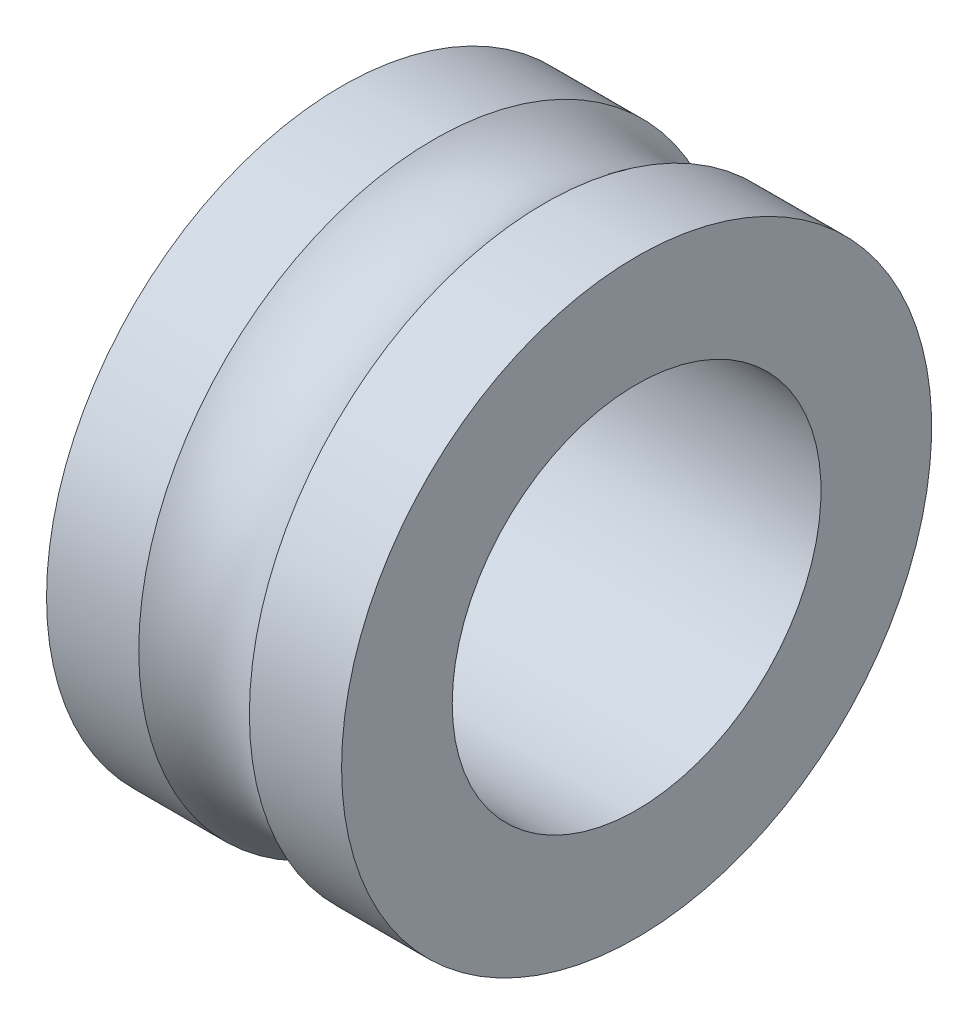
ISO-10303-21;
HEADER;
FILE_DESCRIPTION(('STEP AP214'),'2;1');
FILE_NAME('part.step','',(''),(''),'','','');
FILE_SCHEMA(('AUTOMOTIVE_DESIGN { 1 0 10303 214 1 1 1 1 }'));
ENDSEC;
DATA;
#1=APPLICATION_CONTEXT('core data for automotive mechanical design processes');
#2=APPLICATION_PROTOCOL_DEFINITION('international standard','automotive_design',2000,#1);
#3=PRODUCT_CONTEXT('',#1,'mechanical');
#4=PRODUCT('Part','Part','',(#3));
#5=PRODUCT_RELATED_PRODUCT_CATEGORY('part','',(#4));
#6=PRODUCT_DEFINITION_FORMATION('','',#4);
#7=PRODUCT_DEFINITION_CONTEXT('part definition',#1,'design');
#8=PRODUCT_DEFINITION('design','',#6,#7);
#9=PRODUCT_DEFINITION_SHAPE('','',#8);
#10=(LENGTH_UNIT() NAMED_UNIT(*) SI_UNIT(.MILLI.,.METRE.));
#11=(NAMED_UNIT(*) PLANE_ANGLE_UNIT() SI_UNIT($,.RADIAN.));
#12=(NAMED_UNIT(*) SI_UNIT($,.STERADIAN.) SOLID_ANGLE_UNIT());
#13=UNCERTAINTY_MEASURE_WITH_UNIT(LENGTH_MEASURE(1.E-05),#10,'distance_accuracy_value','');
#14=(GEOMETRIC_REPRESENTATION_CONTEXT(3) GLOBAL_UNCERTAINTY_ASSIGNED_CONTEXT((#13)) GLOBAL_UNIT_ASSIGNED_CONTEXT((#10,
#11,#12)) REPRESENTATION_CONTEXT('',''));
#15=CARTESIAN_POINT('',(0.,0.,0.));
#16=DIRECTION('',(0.,0.,1.));
#17=DIRECTION('',(1.,0.,0.));
#18=AXIS2_PLACEMENT_3D('',#15,#16,#17);
#19=CARTESIAN_POINT('',(-1003.74598603526,10.,0.));
#20=DIRECTION('',(-1.,0.,0.));
#21=DIRECTION('',(0.,0.,1.));
#22=AXIS2_PLACEMENT_3D('',#19,#20,#21);
#23=CYLINDRICAL_SURFACE('',#22,8.);
#24=CARTESIAN_POINT('',(-4.,10.,0.));
#25=DIRECTION('',(-1.,0.,0.));
#26=DIRECTION('',(0.,0.,1.));
#27=AXIS2_PLACEMENT_3D('',#24,#25,#26);
#28=CIRCLE('',#27,8.);
#29=CARTESIAN_POINT('',(-4.,10.,8.));
#30=VERTEX_POINT('',#29);
#31=EDGE_CURVE('E55',#30,#30,#28,.T.);
#32=ORIENTED_EDGE('',*,*,#31,.F.);
#33=EDGE_LOOP('',(#32));
#34=FACE_BOUND('',#33,.T.);
#35=CARTESIAN_POINT('',(-1.50000000000006,10.,0.));
#36=DIRECTION('',(-1.,0.,0.));
#37=DIRECTION('',(0.,0.,1.));
#38=AXIS2_PLACEMENT_3D('',#35,#36,#37);
#39=CIRCLE('',#38,8.);
#40=CARTESIAN_POINT('',(-1.50000000000006,10.,8.));
#41=VERTEX_POINT('',#40);
#42=EDGE_CURVE('E10',#41,#41,#39,.T.);
#43=ORIENTED_EDGE('',*,*,#42,.T.);
#44=EDGE_LOOP('',(#43));
#45=FACE_BOUND('',#44,.T.);
#46=ADVANCED_FACE('F33',(#34,#45),#23,.T.);
#47=CARTESIAN_POINT('',(0.,10.,0.));
#48=DIRECTION('',(-1.,0.,0.));
#49=DIRECTION('',(0.,0.,1.));
#50=AXIS2_PLACEMENT_3D('',#47,#48,#49);
#51=TOROIDAL_SURFACE('',#50,10.,2.5);
#52=CARTESIAN_POINT('',(1.50000000000006,10.,0.));
#53=DIRECTION('',(-1.,0.,0.));
#54=DIRECTION('',(0.,0.,1.));
#55=AXIS2_PLACEMENT_3D('',#52,#53,#54);
#56=CIRCLE('',#55,8.);
#57=CARTESIAN_POINT('',(1.50000000000006,10.,8.));
#58=VERTEX_POINT('',#57);
#59=EDGE_CURVE('E39',#58,#58,#56,.T.);
#60=ORIENTED_EDGE('',*,*,#59,.T.);
#61=EDGE_LOOP('',(#60));
#62=FACE_BOUND('',#61,.T.);
#63=ORIENTED_EDGE('',*,*,#42,.F.);
#64=EDGE_LOOP('',(#63));
#65=FACE_BOUND('',#64,.T.);
#66=ADVANCED_FACE('F62',(#62,#65),#51,.F.);
#67=CARTESIAN_POINT('',(-1003.74598603526,10.,0.));
#68=DIRECTION('',(-1.,0.,0.));
#69=DIRECTION('',(0.,0.,1.));
#70=AXIS2_PLACEMENT_3D('',#67,#68,#69);
#71=CYLINDRICAL_SURFACE('',#70,8.);
#72=ORIENTED_EDGE('',*,*,#59,.F.);
#73=EDGE_LOOP('',(#72));
#74=FACE_BOUND('',#73,.T.);
#75=CARTESIAN_POINT('',(4.,10.,0.));
#76=DIRECTION('',(-1.,0.,0.));
#77=DIRECTION('',(0.,0.,1.));
#78=AXIS2_PLACEMENT_3D('',#75,#76,#77);
#79=CIRCLE('',#78,8.);
#80=CARTESIAN_POINT('',(4.,10.,8.));
#81=VERTEX_POINT('',#80);
#82=EDGE_CURVE('E43',#81,#81,#79,.T.);
#83=ORIENTED_EDGE('',*,*,#82,.T.);
#84=EDGE_LOOP('',(#83));
#85=FACE_BOUND('',#84,.T.);
#86=ADVANCED_FACE('F66',(#74,#85),#71,.T.);
#87=CARTESIAN_POINT('',(4.,0.,0.));
#88=DIRECTION('',(-1.,0.,0.));
#89=DIRECTION('',(0.,0.,1.));
#90=AXIS2_PLACEMENT_3D('',#87,#88,#89);
#91=PLANE('',#90);
#92=ORIENTED_EDGE('',*,*,#82,.F.);
#93=EDGE_LOOP('',(#92));
#94=FACE_BOUND('',#93,.T.);
#95=CARTESIAN_POINT('',(4.,10.,0.));
#96=DIRECTION('',(-1.,0.,0.));
#97=DIRECTION('',(0.,0.,1.));
#98=AXIS2_PLACEMENT_3D('',#95,#96,#97);
#99=CIRCLE('',#98,5.);
#100=CARTESIAN_POINT('',(4.,10.,5.));
#101=VERTEX_POINT('',#100);
#102=EDGE_CURVE('E47',#101,#101,#99,.T.);
#103=ORIENTED_EDGE('',*,*,#102,.T.);
#104=EDGE_LOOP('',(#103));
#105=FACE_BOUND('',#104,.T.);
#106=ADVANCED_FACE('F70',(#94,#105),#91,.F.);
#107=CARTESIAN_POINT('',(-1003.74598603526,10.,0.));
#108=DIRECTION('',(-1.,0.,0.));
#109=DIRECTION('',(0.,0.,1.));
#110=AXIS2_PLACEMENT_3D('',#107,#108,#109);
#111=CYLINDRICAL_SURFACE('',#110,5.);
#112=ORIENTED_EDGE('',*,*,#102,.F.);
#113=EDGE_LOOP('',(#112));
#114=FACE_BOUND('',#113,.T.);
#115=CARTESIAN_POINT('',(-4.,10.,0.));
#116=DIRECTION('',(-1.,0.,0.));
#117=DIRECTION('',(0.,0.,1.));
#118=AXIS2_PLACEMENT_3D('',#115,#116,#117);
#119=CIRCLE('',#118,5.);
#120=CARTESIAN_POINT('',(-4.,10.,5.));
#121=VERTEX_POINT('',#120);
#122=EDGE_CURVE('E52',#121,#121,#119,.T.);
#123=ORIENTED_EDGE('',*,*,#122,.T.);
#124=EDGE_LOOP('',(#123));
#125=FACE_BOUND('',#124,.T.);
#126=ADVANCED_FACE('F77',(#114,#125),#111,.F.);
#127=CARTESIAN_POINT('',(-4.,0.,0.));
#128=DIRECTION('',(1.,0.,0.));
#129=DIRECTION('',(0.,0.,-1.));
#130=AXIS2_PLACEMENT_3D('',#127,#128,#129);
#131=PLANE('',#130);
#132=ORIENTED_EDGE('',*,*,#122,.F.);
#133=EDGE_LOOP('',(#132));
#134=FACE_BOUND('',#133,.T.);
#135=ORIENTED_EDGE('',*,*,#31,.T.);
#136=EDGE_LOOP('',(#135));
#137=FACE_BOUND('',#136,.T.);
#138=ADVANCED_FACE('F59',(#134,#137),#131,.F.);
#139=CLOSED_SHELL('',(#46,#66,#86,#106,#126,#138));
#140=MANIFOLD_SOLID_BREP('B2',#139);
#141=ADVANCED_BREP_SHAPE_REPRESENTATION('',(#18,#140),#14);
#142=SHAPE_DEFINITION_REPRESENTATION(#9,#141);
ENDSEC;
END-ISO-10303-21;
